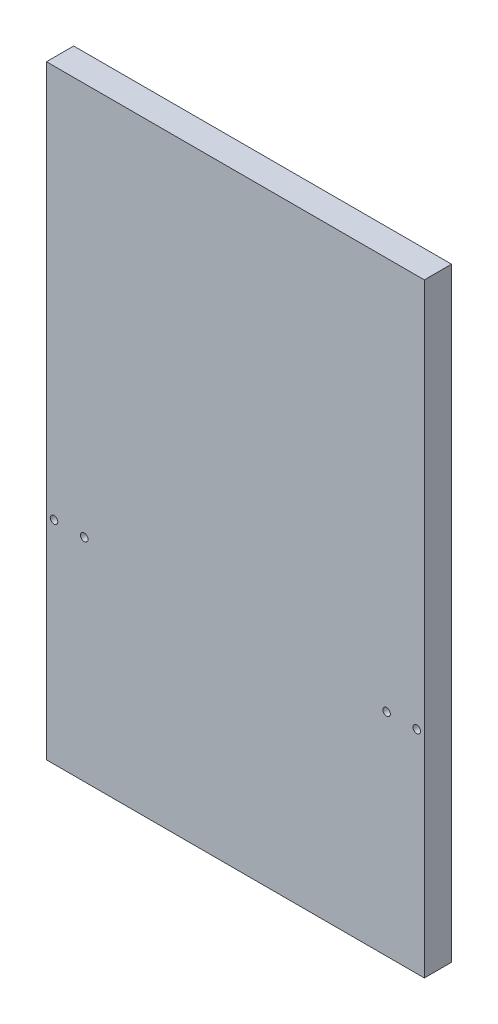
ISO-10303-21;
HEADER;
FILE_DESCRIPTION(('STEP AP214'),'2;1');
FILE_NAME('part.step','',(''),(''),'','','');
FILE_SCHEMA(('AUTOMOTIVE_DESIGN { 1 0 10303 214 1 1 1 1 }'));
ENDSEC;
DATA;
#1=APPLICATION_CONTEXT('core data for automotive mechanical design processes');
#2=APPLICATION_PROTOCOL_DEFINITION('international standard','automotive_design',2000,#1);
#3=PRODUCT_CONTEXT('',#1,'mechanical');
#4=PRODUCT('Part','Part','',(#3));
#5=PRODUCT_RELATED_PRODUCT_CATEGORY('part','',(#4));
#6=PRODUCT_DEFINITION_FORMATION('','',#4);
#7=PRODUCT_DEFINITION_CONTEXT('part definition',#1,'design');
#8=PRODUCT_DEFINITION('design','',#6,#7);
#9=PRODUCT_DEFINITION_SHAPE('','',#8);
#10=(LENGTH_UNIT() NAMED_UNIT(*) SI_UNIT(.MILLI.,.METRE.));
#11=(NAMED_UNIT(*) PLANE_ANGLE_UNIT() SI_UNIT($,.RADIAN.));
#12=(NAMED_UNIT(*) SI_UNIT($,.STERADIAN.) SOLID_ANGLE_UNIT());
#13=UNCERTAINTY_MEASURE_WITH_UNIT(LENGTH_MEASURE(1.E-05),#10,'distance_accuracy_value','');
#14=(GEOMETRIC_REPRESENTATION_CONTEXT(3) GLOBAL_UNCERTAINTY_ASSIGNED_CONTEXT((#13)) GLOBAL_UNIT_ASSIGNED_CONTEXT((#10,
#11,#12)) REPRESENTATION_CONTEXT('',''));
#15=CARTESIAN_POINT('',(0.,0.,0.));
#16=DIRECTION('',(0.,0.,1.));
#17=DIRECTION('',(1.,0.,0.));
#18=AXIS2_PLACEMENT_3D('',#15,#16,#17);
#19=CARTESIAN_POINT('',(0.,0.,18.));
#20=DIRECTION('',(0.,0.,-1.));
#21=DIRECTION('',(-1.,0.,0.));
#22=AXIS2_PLACEMENT_3D('',#19,#20,#21);
#23=PLANE('',#22);
#24=DIRECTION('',(0.,-1.,0.));
#25=VECTOR('',#24,1.);
#26=CARTESIAN_POINT('',(0.,0.,18.));
#27=LINE('',#26,#25);
#28=CARTESIAN_POINT('',(0.,400.,18.));
#29=VERTEX_POINT('',#28);
#30=CARTESIAN_POINT('',(0.,0.,18.));
#31=VERTEX_POINT('',#30);
#32=EDGE_CURVE('E85',#29,#31,#27,.T.);
#33=ORIENTED_EDGE('',*,*,#32,.T.);
#34=DIRECTION('',(1.,0.,0.));
#35=VECTOR('',#34,1.);
#36=CARTESIAN_POINT('',(0.,0.,18.));
#37=LINE('',#36,#35);
#38=CARTESIAN_POINT('',(250.,0.,18.));
#39=VERTEX_POINT('',#38);
#40=EDGE_CURVE('E80',#31,#39,#37,.T.);
#41=ORIENTED_EDGE('',*,*,#40,.T.);
#42=DIRECTION('',(0.,1.,0.));
#43=VECTOR('',#42,1.);
#44=CARTESIAN_POINT('',(250.,0.,18.));
#45=LINE('',#44,#43);
#46=CARTESIAN_POINT('',(250.,400.,18.));
#47=VERTEX_POINT('',#46);
#48=EDGE_CURVE('E83',#39,#47,#45,.T.);
#49=ORIENTED_EDGE('',*,*,#48,.T.);
#50=DIRECTION('',(-1.,0.,0.));
#51=VECTOR('',#50,1.);
#52=CARTESIAN_POINT('',(0.,400.,18.));
#53=LINE('',#52,#51);
#54=EDGE_CURVE('E50',#47,#29,#53,.T.);
#55=ORIENTED_EDGE('',*,*,#54,.T.);
#56=EDGE_LOOP('',(#33,#41,#49,#55));
#57=FACE_BOUND('',#56,.T.);
#58=CARTESIAN_POINT('',(245.,140.,18.));
#59=DIRECTION('',(0.,0.,1.));
#60=DIRECTION('',(1.,0.,0.));
#61=AXIS2_PLACEMENT_3D('',#58,#59,#60);
#62=CIRCLE('',#61,2.5);
#63=CARTESIAN_POINT('',(247.5,140.,18.));
#64=VERTEX_POINT('',#63);
#65=EDGE_CURVE('E100',#64,#64,#62,.T.);
#66=ORIENTED_EDGE('',*,*,#65,.F.);
#67=EDGE_LOOP('',(#66));
#68=FACE_BOUND('',#67,.T.);
#69=CARTESIAN_POINT('',(225.,140.,18.));
#70=DIRECTION('',(0.,0.,1.));
#71=DIRECTION('',(1.,0.,0.));
#72=AXIS2_PLACEMENT_3D('',#69,#70,#71);
#73=CIRCLE('',#72,2.5);
#74=CARTESIAN_POINT('',(227.5,140.,18.));
#75=VERTEX_POINT('',#74);
#76=EDGE_CURVE('E115',#75,#75,#73,.T.);
#77=ORIENTED_EDGE('',*,*,#76,.F.);
#78=EDGE_LOOP('',(#77));
#79=FACE_BOUND('',#78,.T.);
#80=CARTESIAN_POINT('',(5.,140.,18.));
#81=DIRECTION('',(0.,0.,1.));
#82=DIRECTION('',(1.,0.,0.));
#83=AXIS2_PLACEMENT_3D('',#80,#81,#82);
#84=CIRCLE('',#83,2.5);
#85=CARTESIAN_POINT('',(7.5,140.,18.));
#86=VERTEX_POINT('',#85);
#87=EDGE_CURVE('E121',#86,#86,#84,.T.);
#88=ORIENTED_EDGE('',*,*,#87,.F.);
#89=EDGE_LOOP('',(#88));
#90=FACE_BOUND('',#89,.T.);
#91=CARTESIAN_POINT('',(25.,140.,18.));
#92=DIRECTION('',(0.,0.,1.));
#93=DIRECTION('',(1.,0.,0.));
#94=AXIS2_PLACEMENT_3D('',#91,#92,#93);
#95=CIRCLE('',#94,2.5);
#96=CARTESIAN_POINT('',(27.5,140.,18.));
#97=VERTEX_POINT('',#96);
#98=EDGE_CURVE('E127',#97,#97,#95,.T.);
#99=ORIENTED_EDGE('',*,*,#98,.F.);
#100=EDGE_LOOP('',(#99));
#101=FACE_BOUND('',#100,.T.);
#102=ADVANCED_FACE('F33',(#57,#68,#79,#90,#101),#23,.F.);
#103=CARTESIAN_POINT('',(0.,0.,0.));
#104=DIRECTION('',(0.,0.,-1.));
#105=DIRECTION('',(-1.,0.,0.));
#106=AXIS2_PLACEMENT_3D('',#103,#104,#105);
#107=PLANE('',#106);
#108=CARTESIAN_POINT('',(5.,140.,0.));
#109=DIRECTION('',(0.,0.,1.));
#110=DIRECTION('',(1.,0.,0.));
#111=AXIS2_PLACEMENT_3D('',#108,#109,#110);
#112=CIRCLE('',#111,2.5);
#113=CARTESIAN_POINT('',(7.5,140.,0.));
#114=VERTEX_POINT('',#113);
#115=EDGE_CURVE('E124',#114,#114,#112,.T.);
#116=ORIENTED_EDGE('',*,*,#115,.T.);
#117=EDGE_LOOP('',(#116));
#118=FACE_BOUND('',#117,.T.);
#119=CARTESIAN_POINT('',(245.,140.,0.));
#120=DIRECTION('',(0.,0.,1.));
#121=DIRECTION('',(1.,0.,0.));
#122=AXIS2_PLACEMENT_3D('',#119,#120,#121);
#123=CIRCLE('',#122,2.5);
#124=CARTESIAN_POINT('',(247.5,140.,0.));
#125=VERTEX_POINT('',#124);
#126=EDGE_CURVE('E112',#125,#125,#123,.T.);
#127=ORIENTED_EDGE('',*,*,#126,.T.);
#128=EDGE_LOOP('',(#127));
#129=FACE_BOUND('',#128,.T.);
#130=DIRECTION('',(0.,-1.,0.));
#131=VECTOR('',#130,1.);
#132=CARTESIAN_POINT('',(0.,0.,0.));
#133=LINE('',#132,#131);
#134=CARTESIAN_POINT('',(0.,400.,0.));
#135=VERTEX_POINT('',#134);
#136=CARTESIAN_POINT('',(0.,0.,0.));
#137=VERTEX_POINT('',#136);
#138=EDGE_CURVE('E97',#135,#137,#133,.T.);
#139=ORIENTED_EDGE('',*,*,#138,.F.);
#140=DIRECTION('',(-1.,0.,0.));
#141=VECTOR('',#140,1.);
#142=CARTESIAN_POINT('',(0.,400.,0.));
#143=LINE('',#142,#141);
#144=CARTESIAN_POINT('',(250.,400.,0.));
#145=VERTEX_POINT('',#144);
#146=EDGE_CURVE('E73',#145,#135,#143,.T.);
#147=ORIENTED_EDGE('',*,*,#146,.F.);
#148=DIRECTION('',(0.,1.,0.));
#149=VECTOR('',#148,1.);
#150=CARTESIAN_POINT('',(250.,0.,0.));
#151=LINE('',#150,#149);
#152=CARTESIAN_POINT('',(250.,0.,0.));
#153=VERTEX_POINT('',#152);
#154=EDGE_CURVE('E67',#153,#145,#151,.T.);
#155=ORIENTED_EDGE('',*,*,#154,.F.);
#156=DIRECTION('',(1.,0.,0.));
#157=VECTOR('',#156,1.);
#158=CARTESIAN_POINT('',(0.,0.,0.));
#159=LINE('',#158,#157);
#160=EDGE_CURVE('E89',#137,#153,#159,.T.);
#161=ORIENTED_EDGE('',*,*,#160,.F.);
#162=EDGE_LOOP('',(#139,#147,#155,#161));
#163=FACE_BOUND('',#162,.T.);
#164=CARTESIAN_POINT('',(225.,140.,0.));
#165=DIRECTION('',(0.,0.,1.));
#166=DIRECTION('',(1.,0.,0.));
#167=AXIS2_PLACEMENT_3D('',#164,#165,#166);
#168=CIRCLE('',#167,2.5);
#169=CARTESIAN_POINT('',(227.5,140.,0.));
#170=VERTEX_POINT('',#169);
#171=EDGE_CURVE('E118',#170,#170,#168,.T.);
#172=ORIENTED_EDGE('',*,*,#171,.T.);
#173=EDGE_LOOP('',(#172));
#174=FACE_BOUND('',#173,.T.);
#175=CARTESIAN_POINT('',(25.,140.,0.));
#176=DIRECTION('',(0.,0.,1.));
#177=DIRECTION('',(1.,0.,0.));
#178=AXIS2_PLACEMENT_3D('',#175,#176,#177);
#179=CIRCLE('',#178,2.5);
#180=CARTESIAN_POINT('',(27.5,140.,0.));
#181=VERTEX_POINT('',#180);
#182=EDGE_CURVE('E130',#181,#181,#179,.T.);
#183=ORIENTED_EDGE('',*,*,#182,.T.);
#184=EDGE_LOOP('',(#183));
#185=FACE_BOUND('',#184,.T.);
#186=ADVANCED_FACE('F108',(#118,#129,#163,#174,#185),#107,.T.);
#187=CARTESIAN_POINT('',(0.,0.,18.));
#188=DIRECTION('',(1.,0.,0.));
#189=DIRECTION('',(0.,0.,-1.));
#190=AXIS2_PLACEMENT_3D('',#187,#188,#189);
#191=PLANE('',#190);
#192=ORIENTED_EDGE('',*,*,#138,.T.);
#193=DIRECTION('',(0.,0.,-1.));
#194=VECTOR('',#193,1.);
#195=CARTESIAN_POINT('',(0.,0.,18.));
#196=LINE('',#195,#194);
#197=EDGE_CURVE('E11',#31,#137,#196,.T.);
#198=ORIENTED_EDGE('',*,*,#197,.F.);
#199=ORIENTED_EDGE('',*,*,#32,.F.);
#200=DIRECTION('',(0.,0.,-1.));
#201=VECTOR('',#200,1.);
#202=CARTESIAN_POINT('',(0.,400.,18.));
#203=LINE('',#202,#201);
#204=EDGE_CURVE('E93',#29,#135,#203,.T.);
#205=ORIENTED_EDGE('',*,*,#204,.T.);
#206=EDGE_LOOP('',(#192,#198,#199,#205));
#207=FACE_BOUND('',#206,.T.);
#208=ADVANCED_FACE('F35',(#207),#191,.F.);
#209=CARTESIAN_POINT('',(0.,0.,18.));
#210=DIRECTION('',(0.,1.,0.));
#211=DIRECTION('',(0.,0.,1.));
#212=AXIS2_PLACEMENT_3D('',#209,#210,#211);
#213=PLANE('',#212);
#214=ORIENTED_EDGE('',*,*,#160,.T.);
#215=DIRECTION('',(0.,0.,-1.));
#216=VECTOR('',#215,1.);
#217=CARTESIAN_POINT('',(250.,0.,18.));
#218=LINE('',#217,#216);
#219=EDGE_CURVE('E42',#39,#153,#218,.T.);
#220=ORIENTED_EDGE('',*,*,#219,.F.);
#221=ORIENTED_EDGE('',*,*,#40,.F.);
#222=ORIENTED_EDGE('',*,*,#197,.T.);
#223=EDGE_LOOP('',(#214,#220,#221,#222));
#224=FACE_BOUND('',#223,.T.);
#225=ADVANCED_FACE('F88',(#224),#213,.F.);
#226=CARTESIAN_POINT('',(250.,0.,18.));
#227=DIRECTION('',(-1.,0.,0.));
#228=DIRECTION('',(0.,0.,1.));
#229=AXIS2_PLACEMENT_3D('',#226,#227,#228);
#230=PLANE('',#229);
#231=ORIENTED_EDGE('',*,*,#154,.T.);
#232=DIRECTION('',(0.,0.,-1.));
#233=VECTOR('',#232,1.);
#234=CARTESIAN_POINT('',(250.,400.,18.));
#235=LINE('',#234,#233);
#236=EDGE_CURVE('E90',#47,#145,#235,.T.);
#237=ORIENTED_EDGE('',*,*,#236,.F.);
#238=ORIENTED_EDGE('',*,*,#48,.F.);
#239=ORIENTED_EDGE('',*,*,#219,.T.);
#240=EDGE_LOOP('',(#231,#237,#238,#239));
#241=FACE_BOUND('',#240,.T.);
#242=ADVANCED_FACE('F91',(#241),#230,.F.);
#243=CARTESIAN_POINT('',(0.,400.,18.));
#244=DIRECTION('',(0.,-1.,0.));
#245=DIRECTION('',(0.,0.,-1.));
#246=AXIS2_PLACEMENT_3D('',#243,#244,#245);
#247=PLANE('',#246);
#248=ORIENTED_EDGE('',*,*,#146,.T.);
#249=ORIENTED_EDGE('',*,*,#204,.F.);
#250=ORIENTED_EDGE('',*,*,#54,.F.);
#251=ORIENTED_EDGE('',*,*,#236,.T.);
#252=EDGE_LOOP('',(#248,#249,#250,#251));
#253=FACE_BOUND('',#252,.T.);
#254=ADVANCED_FACE('F105',(#253),#247,.F.);
#255=CARTESIAN_POINT('',(245.,140.,18.));
#256=DIRECTION('',(0.,0.,-1.));
#257=DIRECTION('',(-1.,0.,0.));
#258=AXIS2_PLACEMENT_3D('',#255,#256,#257);
#259=CYLINDRICAL_SURFACE('',#258,2.5);
#260=ORIENTED_EDGE('',*,*,#65,.T.);
#261=EDGE_LOOP('',(#260));
#262=FACE_BOUND('',#261,.T.);
#263=ORIENTED_EDGE('',*,*,#126,.F.);
#264=EDGE_LOOP('',(#263));
#265=FACE_BOUND('',#264,.T.);
#266=ADVANCED_FACE('F147',(#262,#265),#259,.F.);
#267=CARTESIAN_POINT('',(225.,140.,18.));
#268=DIRECTION('',(0.,0.,-1.));
#269=DIRECTION('',(-1.,0.,0.));
#270=AXIS2_PLACEMENT_3D('',#267,#268,#269);
#271=CYLINDRICAL_SURFACE('',#270,2.5);
#272=ORIENTED_EDGE('',*,*,#76,.T.);
#273=EDGE_LOOP('',(#272));
#274=FACE_BOUND('',#273,.T.);
#275=ORIENTED_EDGE('',*,*,#171,.F.);
#276=EDGE_LOOP('',(#275));
#277=FACE_BOUND('',#276,.T.);
#278=ADVANCED_FACE('F193',(#274,#277),#271,.F.);
#279=CARTESIAN_POINT('',(5.,140.,18.));
#280=DIRECTION('',(0.,0.,-1.));
#281=DIRECTION('',(-1.,0.,0.));
#282=AXIS2_PLACEMENT_3D('',#279,#280,#281);
#283=CYLINDRICAL_SURFACE('',#282,2.5);
#284=ORIENTED_EDGE('',*,*,#87,.T.);
#285=EDGE_LOOP('',(#284));
#286=FACE_BOUND('',#285,.T.);
#287=ORIENTED_EDGE('',*,*,#115,.F.);
#288=EDGE_LOOP('',(#287));
#289=FACE_BOUND('',#288,.T.);
#290=ADVANCED_FACE('F201',(#286,#289),#283,.F.);
#291=CARTESIAN_POINT('',(25.,140.,18.));
#292=DIRECTION('',(0.,0.,-1.));
#293=DIRECTION('',(-1.,0.,0.));
#294=AXIS2_PLACEMENT_3D('',#291,#292,#293);
#295=CYLINDRICAL_SURFACE('',#294,2.5);
#296=ORIENTED_EDGE('',*,*,#98,.T.);
#297=EDGE_LOOP('',(#296));
#298=FACE_BOUND('',#297,.T.);
#299=ORIENTED_EDGE('',*,*,#182,.F.);
#300=EDGE_LOOP('',(#299));
#301=FACE_BOUND('',#300,.T.);
#302=ADVANCED_FACE('F136',(#298,#301),#295,.F.);
#303=CLOSED_SHELL('',(#102,#186,#208,#225,#242,#254,#266,#278,#290,#302));
#304=MANIFOLD_SOLID_BREP('B2',#303);
#305=ADVANCED_BREP_SHAPE_REPRESENTATION('',(#18,#304),#14);
#306=SHAPE_DEFINITION_REPRESENTATION(#9,#305);
ENDSEC;
END-ISO-10303-21;
